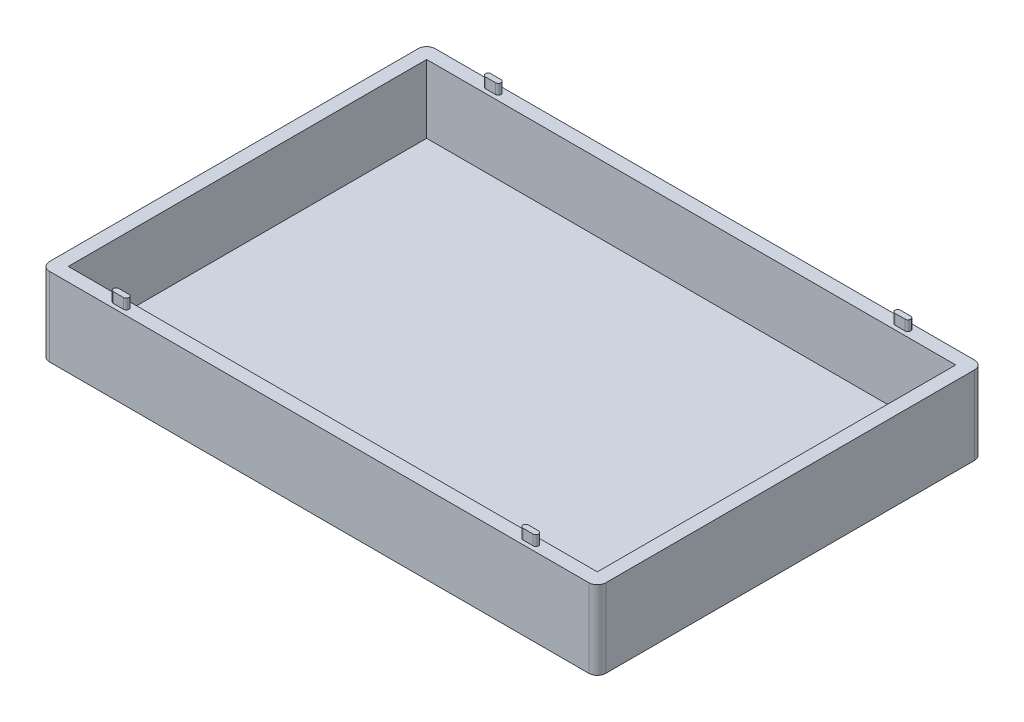
ISO-10303-21;
HEADER;
FILE_DESCRIPTION(('STEP AP214'),'2;1');
FILE_NAME('part.step','',(''),(''),'','','');
FILE_SCHEMA(('AUTOMOTIVE_DESIGN { 1 0 10303 214 1 1 1 1 }'));
ENDSEC;
DATA;
#1=APPLICATION_CONTEXT('core data for automotive mechanical design processes');
#2=APPLICATION_PROTOCOL_DEFINITION('international standard','automotive_design',2000,#1);
#3=PRODUCT_CONTEXT('',#1,'mechanical');
#4=PRODUCT('Part','Part','',(#3));
#5=PRODUCT_RELATED_PRODUCT_CATEGORY('part','',(#4));
#6=PRODUCT_DEFINITION_FORMATION('','',#4);
#7=PRODUCT_DEFINITION_CONTEXT('part definition',#1,'design');
#8=PRODUCT_DEFINITION('design','',#6,#7);
#9=PRODUCT_DEFINITION_SHAPE('','',#8);
#10=(LENGTH_UNIT() NAMED_UNIT(*) SI_UNIT(.MILLI.,.METRE.));
#11=(NAMED_UNIT(*) PLANE_ANGLE_UNIT() SI_UNIT($,.RADIAN.));
#12=(NAMED_UNIT(*) SI_UNIT($,.STERADIAN.) SOLID_ANGLE_UNIT());
#13=UNCERTAINTY_MEASURE_WITH_UNIT(LENGTH_MEASURE(1.E-05),#10,'distance_accuracy_value','');
#14=(GEOMETRIC_REPRESENTATION_CONTEXT(3) GLOBAL_UNCERTAINTY_ASSIGNED_CONTEXT((#13)) GLOBAL_UNIT_ASSIGNED_CONTEXT((#10,
#11,#12)) REPRESENTATION_CONTEXT('',''));
#15=CARTESIAN_POINT('',(0.,0.,0.));
#16=DIRECTION('',(0.,0.,1.));
#17=DIRECTION('',(1.,0.,0.));
#18=AXIS2_PLACEMENT_3D('',#15,#16,#17);
#19=CARTESIAN_POINT('',(0.,23.,0.));
#20=DIRECTION('',(0.,1.,0.));
#21=DIRECTION('',(0.,0.,1.));
#22=AXIS2_PLACEMENT_3D('',#19,#20,#21);
#23=PLANE('',#22);
#24=DIRECTION('',(0.,0.,-1.));
#25=VECTOR('',#24,1.);
#26=CARTESIAN_POINT('',(77.5,23.,52.5));
#27=LINE('',#26,#25);
#28=CARTESIAN_POINT('',(77.5,23.,52.5));
#29=VERTEX_POINT('',#28);
#30=CARTESIAN_POINT('',(77.5,23.,-52.5));
#31=VERTEX_POINT('',#30);
#32=EDGE_CURVE('E335',#29,#31,#27,.T.);
#33=ORIENTED_EDGE('',*,*,#32,.F.);
#34=DIRECTION('',(-1.,0.,0.));
#35=VECTOR('',#34,1.);
#36=CARTESIAN_POINT('',(77.5,23.,52.5));
#37=LINE('',#36,#35);
#38=CARTESIAN_POINT('',(-77.5,23.,52.5));
#39=VERTEX_POINT('',#38);
#40=EDGE_CURVE('E340',#29,#39,#37,.T.);
#41=ORIENTED_EDGE('',*,*,#40,.T.);
#42=DIRECTION('',(0.,0.,-1.));
#43=VECTOR('',#42,1.);
#44=CARTESIAN_POINT('',(-77.5,23.,52.5));
#45=LINE('',#44,#43);
#46=CARTESIAN_POINT('',(-77.5,23.,-52.5));
#47=VERTEX_POINT('',#46);
#48=EDGE_CURVE('E352',#39,#47,#45,.T.);
#49=ORIENTED_EDGE('',*,*,#48,.T.);
#50=DIRECTION('',(-1.,0.,0.));
#51=VECTOR('',#50,1.);
#52=CARTESIAN_POINT('',(77.5,23.,-52.5));
#53=LINE('',#52,#51);
#54=EDGE_CURVE('E349',#31,#47,#53,.T.);
#55=ORIENTED_EDGE('',*,*,#54,.F.);
#56=EDGE_LOOP('',(#33,#41,#49,#55));
#57=FACE_BOUND('',#56,.T.);
#58=DIRECTION('',(0.,0.,-1.));
#59=VECTOR('',#58,1.);
#60=CARTESIAN_POINT('',(81.5,23.,-56.5));
#61=LINE('',#60,#59);
#62=CARTESIAN_POINT('',(81.5,23.,54.));
#63=VERTEX_POINT('',#62);
#64=CARTESIAN_POINT('',(81.5,23.,-54.));
#65=VERTEX_POINT('',#64);
#66=EDGE_CURVE('E366',#63,#65,#61,.T.);
#67=ORIENTED_EDGE('',*,*,#66,.T.);
#68=CARTESIAN_POINT('',(79.,23.,-54.));
#69=DIRECTION('',(0.,1.,0.));
#70=DIRECTION('',(0.,0.,1.));
#71=AXIS2_PLACEMENT_3D('',#68,#69,#70);
#72=CIRCLE('',#71,2.5);
#73=CARTESIAN_POINT('',(79.,23.,-56.5));
#74=VERTEX_POINT('',#73);
#75=EDGE_CURVE('E415',#65,#74,#72,.T.);
#76=ORIENTED_EDGE('',*,*,#75,.T.);
#77=DIRECTION('',(-1.,0.,0.));
#78=VECTOR('',#77,1.);
#79=CARTESIAN_POINT('',(-81.5,23.,-56.5));
#80=LINE('',#79,#78);
#81=CARTESIAN_POINT('',(-79.,23.,-56.5));
#82=VERTEX_POINT('',#81);
#83=EDGE_CURVE('E369',#74,#82,#80,.T.);
#84=ORIENTED_EDGE('',*,*,#83,.T.);
#85=CARTESIAN_POINT('',(-79.,23.,-54.));
#86=DIRECTION('',(0.,1.,0.));
#87=DIRECTION('',(0.,0.,1.));
#88=AXIS2_PLACEMENT_3D('',#85,#86,#87);
#89=CIRCLE('',#88,2.5);
#90=CARTESIAN_POINT('',(-81.5,23.,-54.));
#91=VERTEX_POINT('',#90);
#92=EDGE_CURVE('E413',#82,#91,#89,.T.);
#93=ORIENTED_EDGE('',*,*,#92,.T.);
#94=DIRECTION('',(0.,0.,1.));
#95=VECTOR('',#94,1.);
#96=CARTESIAN_POINT('',(-81.5,23.,-56.5));
#97=LINE('',#96,#95);
#98=CARTESIAN_POINT('',(-81.5,23.,54.));
#99=VERTEX_POINT('',#98);
#100=EDGE_CURVE('E373',#91,#99,#97,.T.);
#101=ORIENTED_EDGE('',*,*,#100,.T.);
#102=CARTESIAN_POINT('',(-79.,23.,54.));
#103=DIRECTION('',(0.,1.,0.));
#104=DIRECTION('',(0.,0.,1.));
#105=AXIS2_PLACEMENT_3D('',#102,#103,#104);
#106=CIRCLE('',#105,2.5);
#107=CARTESIAN_POINT('',(-79.,23.,56.5));
#108=VERTEX_POINT('',#107);
#109=EDGE_CURVE('E411',#99,#108,#106,.T.);
#110=ORIENTED_EDGE('',*,*,#109,.T.);
#111=DIRECTION('',(1.,0.,0.));
#112=VECTOR('',#111,1.);
#113=CARTESIAN_POINT('',(-81.5,23.,56.5));
#114=LINE('',#113,#112);
#115=CARTESIAN_POINT('',(79.,23.,56.5));
#116=VERTEX_POINT('',#115);
#117=EDGE_CURVE('E376',#108,#116,#114,.T.);
#118=ORIENTED_EDGE('',*,*,#117,.T.);
#119=CARTESIAN_POINT('',(79.,23.,54.));
#120=DIRECTION('',(0.,1.,0.));
#121=DIRECTION('',(0.,0.,1.));
#122=AXIS2_PLACEMENT_3D('',#119,#120,#121);
#123=CIRCLE('',#122,2.5);
#124=EDGE_CURVE('E396',#116,#63,#123,.T.);
#125=ORIENTED_EDGE('',*,*,#124,.T.);
#126=EDGE_LOOP('',(#67,#76,#84,#93,#101,#110,#118,#125));
#127=FACE_BOUND('',#126,.T.);
#128=DIRECTION('',(1.,0.,0.));
#129=VECTOR('',#128,1.);
#130=CARTESIAN_POINT('',(58.5,23.,55.3));
#131=LINE('',#130,#129);
#132=CARTESIAN_POINT('',(58.5,23.,55.3));
#133=VERTEX_POINT('',#132);
#134=CARTESIAN_POINT('',(61.5,23.,55.3));
#135=VERTEX_POINT('',#134);
#136=EDGE_CURVE('E320',#133,#135,#131,.T.);
#137=ORIENTED_EDGE('',*,*,#136,.F.);
#138=CARTESIAN_POINT('',(58.5,23.,54.5));
#139=DIRECTION('',(0.,1.,0.));
#140=DIRECTION('',(0.,0.,1.));
#141=AXIS2_PLACEMENT_3D('',#138,#139,#140);
#142=CIRCLE('',#141,0.800000000000002);
#143=CARTESIAN_POINT('',(58.5,23.,53.7));
#144=VERTEX_POINT('',#143);
#145=EDGE_CURVE('E306',#144,#133,#142,.T.);
#146=ORIENTED_EDGE('',*,*,#145,.F.);
#147=DIRECTION('',(-1.,0.,0.));
#148=VECTOR('',#147,1.);
#149=CARTESIAN_POINT('',(58.5,23.,53.7));
#150=LINE('',#149,#148);
#151=CARTESIAN_POINT('',(61.5,23.,53.7));
#152=VERTEX_POINT('',#151);
#153=EDGE_CURVE('E311',#152,#144,#150,.T.);
#154=ORIENTED_EDGE('',*,*,#153,.F.);
#155=CARTESIAN_POINT('',(61.5,23.,54.5));
#156=DIRECTION('',(0.,1.,0.));
#157=DIRECTION('',(0.,0.,1.));
#158=AXIS2_PLACEMENT_3D('',#155,#156,#157);
#159=CIRCLE('',#158,0.800000000000002);
#160=EDGE_CURVE('E322',#135,#152,#159,.T.);
#161=ORIENTED_EDGE('',*,*,#160,.F.);
#162=EDGE_LOOP('',(#137,#146,#154,#161));
#163=FACE_BOUND('',#162,.T.);
#164=DIRECTION('',(1.,0.,0.));
#165=VECTOR('',#164,1.);
#166=CARTESIAN_POINT('',(-61.5,23.,55.3));
#167=LINE('',#166,#165);
#168=CARTESIAN_POINT('',(-61.5,23.,55.3));
#169=VERTEX_POINT('',#168);
#170=CARTESIAN_POINT('',(-58.5,23.,55.3));
#171=VERTEX_POINT('',#170);
#172=EDGE_CURVE('E291',#169,#171,#167,.T.);
#173=ORIENTED_EDGE('',*,*,#172,.F.);
#174=CARTESIAN_POINT('',(-61.5,23.,54.5));
#175=DIRECTION('',(0.,1.,0.));
#176=DIRECTION('',(0.,0.,1.));
#177=AXIS2_PLACEMENT_3D('',#174,#175,#176);
#178=CIRCLE('',#177,0.800000000000002);
#179=CARTESIAN_POINT('',(-61.5,23.,53.7));
#180=VERTEX_POINT('',#179);
#181=EDGE_CURVE('E277',#180,#169,#178,.T.);
#182=ORIENTED_EDGE('',*,*,#181,.F.);
#183=DIRECTION('',(-1.,0.,0.));
#184=VECTOR('',#183,1.);
#185=CARTESIAN_POINT('',(-61.5,23.,53.7));
#186=LINE('',#185,#184);
#187=CARTESIAN_POINT('',(-58.5,23.,53.7));
#188=VERTEX_POINT('',#187);
#189=EDGE_CURVE('E282',#188,#180,#186,.T.);
#190=ORIENTED_EDGE('',*,*,#189,.F.);
#191=CARTESIAN_POINT('',(-58.5,23.,54.5));
#192=DIRECTION('',(0.,1.,0.));
#193=DIRECTION('',(0.,0.,1.));
#194=AXIS2_PLACEMENT_3D('',#191,#192,#193);
#195=CIRCLE('',#194,0.800000000000002);
#196=EDGE_CURVE('E293',#171,#188,#195,.T.);
#197=ORIENTED_EDGE('',*,*,#196,.F.);
#198=EDGE_LOOP('',(#173,#182,#190,#197));
#199=FACE_BOUND('',#198,.T.);
#200=DIRECTION('',(1.,0.,0.));
#201=VECTOR('',#200,1.);
#202=CARTESIAN_POINT('',(-61.5,23.,-53.7));
#203=LINE('',#202,#201);
#204=CARTESIAN_POINT('',(-61.5,23.,-53.7));
#205=VERTEX_POINT('',#204);
#206=CARTESIAN_POINT('',(-58.5,23.,-53.7));
#207=VERTEX_POINT('',#206);
#208=EDGE_CURVE('E249',#205,#207,#203,.T.);
#209=ORIENTED_EDGE('',*,*,#208,.F.);
#210=CARTESIAN_POINT('',(-61.5,23.,-54.5));
#211=DIRECTION('',(0.,1.,0.));
#212=DIRECTION('',(0.,0.,1.));
#213=AXIS2_PLACEMENT_3D('',#210,#211,#212);
#214=CIRCLE('',#213,0.800000000000006);
#215=CARTESIAN_POINT('',(-61.5,23.,-55.3));
#216=VERTEX_POINT('',#215);
#217=EDGE_CURVE('E246',#216,#205,#214,.T.);
#218=ORIENTED_EDGE('',*,*,#217,.F.);
#219=DIRECTION('',(-1.,0.,0.));
#220=VECTOR('',#219,1.);
#221=CARTESIAN_POINT('',(-61.5,23.,-55.3));
#222=LINE('',#221,#220);
#223=CARTESIAN_POINT('',(-58.5,23.,-55.3));
#224=VERTEX_POINT('',#223);
#225=EDGE_CURVE('E258',#224,#216,#222,.T.);
#226=ORIENTED_EDGE('',*,*,#225,.F.);
#227=CARTESIAN_POINT('',(-58.5,23.,-54.5));
#228=DIRECTION('',(0.,1.,0.));
#229=DIRECTION('',(0.,0.,1.));
#230=AXIS2_PLACEMENT_3D('',#227,#228,#229);
#231=CIRCLE('',#230,0.800000000000006);
#232=EDGE_CURVE('E266',#207,#224,#231,.T.);
#233=ORIENTED_EDGE('',*,*,#232,.F.);
#234=EDGE_LOOP('',(#209,#218,#226,#233));
#235=FACE_BOUND('',#234,.T.);
#236=DIRECTION('',(1.,0.,0.));
#237=VECTOR('',#236,1.);
#238=CARTESIAN_POINT('',(58.5,23.,-53.7));
#239=LINE('',#238,#237);
#240=CARTESIAN_POINT('',(58.5,23.,-53.7));
#241=VERTEX_POINT('',#240);
#242=CARTESIAN_POINT('',(61.5,23.,-53.7));
#243=VERTEX_POINT('',#242);
#244=EDGE_CURVE('E774',#241,#243,#239,.T.);
#245=ORIENTED_EDGE('',*,*,#244,.F.);
#246=CARTESIAN_POINT('',(58.5,23.,-54.5));
#247=DIRECTION('',(0.,1.,0.));
#248=DIRECTION('',(0.,0.,1.));
#249=AXIS2_PLACEMENT_3D('',#246,#247,#248);
#250=CIRCLE('',#249,0.800000000000002);
#251=CARTESIAN_POINT('',(58.5,23.,-55.3));
#252=VERTEX_POINT('',#251);
#253=EDGE_CURVE('E244',#252,#241,#250,.T.);
#254=ORIENTED_EDGE('',*,*,#253,.F.);
#255=DIRECTION('',(-1.,0.,0.));
#256=VECTOR('',#255,1.);
#257=CARTESIAN_POINT('',(58.5,23.,-55.3));
#258=LINE('',#257,#256);
#259=CARTESIAN_POINT('',(61.5,23.,-55.3));
#260=VERTEX_POINT('',#259);
#261=EDGE_CURVE('E240',#260,#252,#258,.T.);
#262=ORIENTED_EDGE('',*,*,#261,.F.);
#263=CARTESIAN_POINT('',(61.5,23.,-54.5));
#264=DIRECTION('',(0.,1.,0.));
#265=DIRECTION('',(0.,0.,1.));
#266=AXIS2_PLACEMENT_3D('',#263,#264,#265);
#267=CIRCLE('',#266,0.800000000000002);
#268=EDGE_CURVE('E771',#243,#260,#267,.T.);
#269=ORIENTED_EDGE('',*,*,#268,.F.);
#270=EDGE_LOOP('',(#245,#254,#262,#269));
#271=FACE_BOUND('',#270,.T.);
#272=ADVANCED_FACE('F35',(#57,#127,#163,#199,#235,#271),#23,.T.);
#273=CARTESIAN_POINT('',(81.5,23.,-56.5));
#274=DIRECTION('',(-1.,0.,0.));
#275=DIRECTION('',(0.,0.,1.));
#276=AXIS2_PLACEMENT_3D('',#273,#274,#275);
#277=PLANE('',#276);
#278=DIRECTION('',(0.,0.,-1.));
#279=VECTOR('',#278,1.);
#280=CARTESIAN_POINT('',(81.5,0.,-56.5));
#281=LINE('',#280,#279);
#282=CARTESIAN_POINT('',(81.5,0.,54.));
#283=VERTEX_POINT('',#282);
#284=CARTESIAN_POINT('',(81.5,0.,-54.));
#285=VERTEX_POINT('',#284);
#286=EDGE_CURVE('E359',#283,#285,#281,.T.);
#287=ORIENTED_EDGE('',*,*,#286,.T.);
#288=DIRECTION('',(0.,-1.,0.));
#289=VECTOR('',#288,1.);
#290=CARTESIAN_POINT('',(81.5,23.,-54.));
#291=LINE('',#290,#289);
#292=EDGE_CURVE('E409',#285,#65,#291,.F.);
#293=ORIENTED_EDGE('',*,*,#292,.T.);
#294=ORIENTED_EDGE('',*,*,#66,.F.);
#295=DIRECTION('',(0.,-1.,0.));
#296=VECTOR('',#295,1.);
#297=CARTESIAN_POINT('',(81.5,23.,54.));
#298=LINE('',#297,#296);
#299=EDGE_CURVE('E378',#63,#283,#298,.T.);
#300=ORIENTED_EDGE('',*,*,#299,.T.);
#301=EDGE_LOOP('',(#287,#293,#294,#300));
#302=FACE_BOUND('',#301,.T.);
#303=ADVANCED_FACE('F452',(#302),#277,.F.);
#304=CARTESIAN_POINT('',(-81.5,23.,-56.5));
#305=DIRECTION('',(0.,0.,1.));
#306=DIRECTION('',(1.,0.,0.));
#307=AXIS2_PLACEMENT_3D('',#304,#305,#306);
#308=PLANE('',#307);
#309=ORIENTED_EDGE('',*,*,#83,.F.);
#310=DIRECTION('',(0.,-1.,0.));
#311=VECTOR('',#310,1.);
#312=CARTESIAN_POINT('',(79.,23.,-56.5));
#313=LINE('',#312,#311);
#314=CARTESIAN_POINT('',(79.,0.,-56.5));
#315=VERTEX_POINT('',#314);
#316=EDGE_CURVE('E400',#74,#315,#313,.T.);
#317=ORIENTED_EDGE('',*,*,#316,.T.);
#318=DIRECTION('',(-1.,0.,0.));
#319=VECTOR('',#318,1.);
#320=CARTESIAN_POINT('',(-81.5,0.,-56.5));
#321=LINE('',#320,#319);
#322=CARTESIAN_POINT('',(-79.,0.,-56.5));
#323=VERTEX_POINT('',#322);
#324=EDGE_CURVE('E381',#315,#323,#321,.T.);
#325=ORIENTED_EDGE('',*,*,#324,.T.);
#326=DIRECTION('',(0.,-1.,0.));
#327=VECTOR('',#326,1.);
#328=CARTESIAN_POINT('',(-79.,23.,-56.5));
#329=LINE('',#328,#327);
#330=EDGE_CURVE('E398',#323,#82,#329,.F.);
#331=ORIENTED_EDGE('',*,*,#330,.T.);
#332=EDGE_LOOP('',(#309,#317,#325,#331));
#333=FACE_BOUND('',#332,.T.);
#334=ADVANCED_FACE('F446',(#333),#308,.F.);
#335=CARTESIAN_POINT('',(-81.5,23.,-56.5));
#336=DIRECTION('',(1.,0.,0.));
#337=DIRECTION('',(0.,0.,-1.));
#338=AXIS2_PLACEMENT_3D('',#335,#336,#337);
#339=PLANE('',#338);
#340=ORIENTED_EDGE('',*,*,#100,.F.);
#341=DIRECTION('',(0.,-1.,0.));
#342=VECTOR('',#341,1.);
#343=CARTESIAN_POINT('',(-81.5,23.,-54.));
#344=LINE('',#343,#342);
#345=CARTESIAN_POINT('',(-81.5,0.,-54.));
#346=VERTEX_POINT('',#345);
#347=EDGE_CURVE('E43',#91,#346,#344,.T.);
#348=ORIENTED_EDGE('',*,*,#347,.T.);
#349=DIRECTION('',(0.,0.,1.));
#350=VECTOR('',#349,1.);
#351=CARTESIAN_POINT('',(-81.5,0.,-56.5));
#352=LINE('',#351,#350);
#353=CARTESIAN_POINT('',(-81.5,0.,54.));
#354=VERTEX_POINT('',#353);
#355=EDGE_CURVE('E384',#346,#354,#352,.T.);
#356=ORIENTED_EDGE('',*,*,#355,.T.);
#357=DIRECTION('',(0.,-1.,0.));
#358=VECTOR('',#357,1.);
#359=CARTESIAN_POINT('',(-81.5,23.,54.));
#360=LINE('',#359,#358);
#361=EDGE_CURVE('E417',#354,#99,#360,.F.);
#362=ORIENTED_EDGE('',*,*,#361,.T.);
#363=EDGE_LOOP('',(#340,#348,#356,#362));
#364=FACE_BOUND('',#363,.T.);
#365=ADVANCED_FACE('F423',(#364),#339,.F.);
#366=CARTESIAN_POINT('',(-81.5,23.,56.5));
#367=DIRECTION('',(0.,0.,-1.));
#368=DIRECTION('',(-1.,0.,0.));
#369=AXIS2_PLACEMENT_3D('',#366,#367,#368);
#370=PLANE('',#369);
#371=ORIENTED_EDGE('',*,*,#117,.F.);
#372=DIRECTION('',(0.,-1.,0.));
#373=VECTOR('',#372,1.);
#374=CARTESIAN_POINT('',(-79.,23.,56.5));
#375=LINE('',#374,#373);
#376=CARTESIAN_POINT('',(-79.,0.,56.5));
#377=VERTEX_POINT('',#376);
#378=EDGE_CURVE('E12',#108,#377,#375,.T.);
#379=ORIENTED_EDGE('',*,*,#378,.T.);
#380=DIRECTION('',(1.,0.,0.));
#381=VECTOR('',#380,1.);
#382=CARTESIAN_POINT('',(-81.5,0.,56.5));
#383=LINE('',#382,#381);
#384=CARTESIAN_POINT('',(79.,0.,56.5));
#385=VERTEX_POINT('',#384);
#386=EDGE_CURVE('E370',#377,#385,#383,.T.);
#387=ORIENTED_EDGE('',*,*,#386,.T.);
#388=DIRECTION('',(0.,-1.,0.));
#389=VECTOR('',#388,1.);
#390=CARTESIAN_POINT('',(79.,23.,56.5));
#391=LINE('',#390,#389);
#392=EDGE_CURVE('E393',#385,#116,#391,.F.);
#393=ORIENTED_EDGE('',*,*,#392,.T.);
#394=EDGE_LOOP('',(#371,#379,#387,#393));
#395=FACE_BOUND('',#394,.T.);
#396=ADVANCED_FACE('F436',(#395),#370,.F.);
#397=CARTESIAN_POINT('',(0.,0.,0.));
#398=DIRECTION('',(0.,1.,0.));
#399=DIRECTION('',(0.,0.,1.));
#400=AXIS2_PLACEMENT_3D('',#397,#398,#399);
#401=PLANE('',#400);
#402=ORIENTED_EDGE('',*,*,#324,.F.);
#403=CARTESIAN_POINT('',(79.,0.,-54.));
#404=DIRECTION('',(0.,1.,0.));
#405=DIRECTION('',(0.,0.,1.));
#406=AXIS2_PLACEMENT_3D('',#403,#404,#405);
#407=CIRCLE('',#406,2.5);
#408=EDGE_CURVE('E407',#315,#285,#407,.F.);
#409=ORIENTED_EDGE('',*,*,#408,.T.);
#410=ORIENTED_EDGE('',*,*,#286,.F.);
#411=CARTESIAN_POINT('',(79.,0.,54.));
#412=DIRECTION('',(0.,1.,0.));
#413=DIRECTION('',(0.,0.,1.));
#414=AXIS2_PLACEMENT_3D('',#411,#412,#413);
#415=CIRCLE('',#414,2.5);
#416=EDGE_CURVE('E390',#283,#385,#415,.F.);
#417=ORIENTED_EDGE('',*,*,#416,.T.);
#418=ORIENTED_EDGE('',*,*,#386,.F.);
#419=CARTESIAN_POINT('',(-79.,0.,54.));
#420=DIRECTION('',(0.,1.,0.));
#421=DIRECTION('',(0.,0.,1.));
#422=AXIS2_PLACEMENT_3D('',#419,#420,#421);
#423=CIRCLE('',#422,2.5);
#424=EDGE_CURVE('E403',#377,#354,#423,.F.);
#425=ORIENTED_EDGE('',*,*,#424,.T.);
#426=ORIENTED_EDGE('',*,*,#355,.F.);
#427=CARTESIAN_POINT('',(-79.,0.,-54.));
#428=DIRECTION('',(0.,1.,0.));
#429=DIRECTION('',(0.,0.,1.));
#430=AXIS2_PLACEMENT_3D('',#427,#428,#429);
#431=CIRCLE('',#430,2.5);
#432=EDGE_CURVE('E405',#346,#323,#431,.F.);
#433=ORIENTED_EDGE('',*,*,#432,.T.);
#434=EDGE_LOOP('',(#402,#409,#410,#417,#418,#425,#426,#433));
#435=FACE_BOUND('',#434,.T.);
#436=ADVANCED_FACE('F429',(#435),#401,.F.);
#437=CARTESIAN_POINT('',(79.,23.,54.));
#438=DIRECTION('',(0.,-1.,0.));
#439=DIRECTION('',(0.,0.,-1.));
#440=AXIS2_PLACEMENT_3D('',#437,#438,#439);
#441=CYLINDRICAL_SURFACE('',#440,2.5);
#442=ORIENTED_EDGE('',*,*,#124,.F.);
#443=ORIENTED_EDGE('',*,*,#392,.F.);
#444=ORIENTED_EDGE('',*,*,#416,.F.);
#445=ORIENTED_EDGE('',*,*,#299,.F.);
#446=EDGE_LOOP('',(#442,#443,#444,#445));
#447=FACE_BOUND('',#446,.T.);
#448=ADVANCED_FACE('F457',(#447),#441,.T.);
#449=CARTESIAN_POINT('',(79.,23.,-54.));
#450=DIRECTION('',(0.,-1.,0.));
#451=DIRECTION('',(0.,0.,-1.));
#452=AXIS2_PLACEMENT_3D('',#449,#450,#451);
#453=CYLINDRICAL_SURFACE('',#452,2.5);
#454=ORIENTED_EDGE('',*,*,#75,.F.);
#455=ORIENTED_EDGE('',*,*,#292,.F.);
#456=ORIENTED_EDGE('',*,*,#408,.F.);
#457=ORIENTED_EDGE('',*,*,#316,.F.);
#458=EDGE_LOOP('',(#454,#455,#456,#457));
#459=FACE_BOUND('',#458,.T.);
#460=ADVANCED_FACE('F455',(#459),#453,.T.);
#461=CARTESIAN_POINT('',(-79.,23.,-54.));
#462=DIRECTION('',(0.,-1.,0.));
#463=DIRECTION('',(0.,0.,-1.));
#464=AXIS2_PLACEMENT_3D('',#461,#462,#463);
#465=CYLINDRICAL_SURFACE('',#464,2.5);
#466=ORIENTED_EDGE('',*,*,#92,.F.);
#467=ORIENTED_EDGE('',*,*,#330,.F.);
#468=ORIENTED_EDGE('',*,*,#432,.F.);
#469=ORIENTED_EDGE('',*,*,#347,.F.);
#470=EDGE_LOOP('',(#466,#467,#468,#469));
#471=FACE_BOUND('',#470,.T.);
#472=ADVANCED_FACE('F444',(#471),#465,.T.);
#473=CARTESIAN_POINT('',(-79.,23.,54.));
#474=DIRECTION('',(0.,-1.,0.));
#475=DIRECTION('',(0.,0.,-1.));
#476=AXIS2_PLACEMENT_3D('',#473,#474,#475);
#477=CYLINDRICAL_SURFACE('',#476,2.5);
#478=ORIENTED_EDGE('',*,*,#109,.F.);
#479=ORIENTED_EDGE('',*,*,#361,.F.);
#480=ORIENTED_EDGE('',*,*,#424,.F.);
#481=ORIENTED_EDGE('',*,*,#378,.F.);
#482=EDGE_LOOP('',(#478,#479,#480,#481));
#483=FACE_BOUND('',#482,.T.);
#484=ADVANCED_FACE('F37',(#483),#477,.T.);
#485=CARTESIAN_POINT('',(77.5,3.,52.5));
#486=DIRECTION('',(1.,0.,0.));
#487=DIRECTION('',(0.,0.,-1.));
#488=AXIS2_PLACEMENT_3D('',#485,#486,#487);
#489=PLANE('',#488);
#490=ORIENTED_EDGE('',*,*,#32,.T.);
#491=DIRECTION('',(0.,1.,0.));
#492=VECTOR('',#491,1.);
#493=CARTESIAN_POINT('',(77.5,3.,-52.5));
#494=LINE('',#493,#492);
#495=CARTESIAN_POINT('',(77.5,3.,-52.5));
#496=VERTEX_POINT('',#495);
#497=EDGE_CURVE('E347',#496,#31,#494,.T.);
#498=ORIENTED_EDGE('',*,*,#497,.F.);
#499=DIRECTION('',(0.,0.,-1.));
#500=VECTOR('',#499,1.);
#501=CARTESIAN_POINT('',(77.5,3.,52.5));
#502=LINE('',#501,#500);
#503=CARTESIAN_POINT('',(77.5,3.,52.5));
#504=VERTEX_POINT('',#503);
#505=EDGE_CURVE('E336',#504,#496,#502,.T.);
#506=ORIENTED_EDGE('',*,*,#505,.F.);
#507=DIRECTION('',(0.,1.,0.));
#508=VECTOR('',#507,1.);
#509=CARTESIAN_POINT('',(77.5,3.,52.5));
#510=LINE('',#509,#508);
#511=EDGE_CURVE('E357',#504,#29,#510,.T.);
#512=ORIENTED_EDGE('',*,*,#511,.T.);
#513=EDGE_LOOP('',(#490,#498,#506,#512));
#514=FACE_BOUND('',#513,.T.);
#515=ADVANCED_FACE('F475',(#514),#489,.F.);
#516=CARTESIAN_POINT('',(77.5,3.,52.5));
#517=DIRECTION('',(0.,0.,-1.));
#518=DIRECTION('',(-1.,0.,0.));
#519=AXIS2_PLACEMENT_3D('',#516,#517,#518);
#520=PLANE('',#519);
#521=ORIENTED_EDGE('',*,*,#40,.F.);
#522=ORIENTED_EDGE('',*,*,#511,.F.);
#523=DIRECTION('',(-1.,0.,0.));
#524=VECTOR('',#523,1.);
#525=CARTESIAN_POINT('',(77.5,3.,52.5));
#526=LINE('',#525,#524);
#527=CARTESIAN_POINT('',(-77.5,3.,52.5));
#528=VERTEX_POINT('',#527);
#529=EDGE_CURVE('E345',#504,#528,#526,.T.);
#530=ORIENTED_EDGE('',*,*,#529,.T.);
#531=DIRECTION('',(0.,1.,0.));
#532=VECTOR('',#531,1.);
#533=CARTESIAN_POINT('',(-77.5,3.,52.5));
#534=LINE('',#533,#532);
#535=EDGE_CURVE('E360',#528,#39,#534,.T.);
#536=ORIENTED_EDGE('',*,*,#535,.T.);
#537=EDGE_LOOP('',(#521,#522,#530,#536));
#538=FACE_BOUND('',#537,.T.);
#539=ADVANCED_FACE('F529',(#538),#520,.T.);
#540=CARTESIAN_POINT('',(-77.5,3.,52.5));
#541=DIRECTION('',(1.,0.,0.));
#542=DIRECTION('',(0.,0.,-1.));
#543=AXIS2_PLACEMENT_3D('',#540,#541,#542);
#544=PLANE('',#543);
#545=ORIENTED_EDGE('',*,*,#48,.F.);
#546=ORIENTED_EDGE('',*,*,#535,.F.);
#547=DIRECTION('',(0.,0.,-1.));
#548=VECTOR('',#547,1.);
#549=CARTESIAN_POINT('',(-77.5,3.,52.5));
#550=LINE('',#549,#548);
#551=CARTESIAN_POINT('',(-77.5,3.,-52.5));
#552=VERTEX_POINT('',#551);
#553=EDGE_CURVE('E343',#528,#552,#550,.T.);
#554=ORIENTED_EDGE('',*,*,#553,.T.);
#555=DIRECTION('',(0.,1.,0.));
#556=VECTOR('',#555,1.);
#557=CARTESIAN_POINT('',(-77.5,3.,-52.5));
#558=LINE('',#557,#556);
#559=EDGE_CURVE('E362',#552,#47,#558,.T.);
#560=ORIENTED_EDGE('',*,*,#559,.T.);
#561=EDGE_LOOP('',(#545,#546,#554,#560));
#562=FACE_BOUND('',#561,.T.);
#563=ADVANCED_FACE('F538',(#562),#544,.T.);
#564=CARTESIAN_POINT('',(77.5,3.,-52.5));
#565=DIRECTION('',(0.,0.,-1.));
#566=DIRECTION('',(-1.,0.,0.));
#567=AXIS2_PLACEMENT_3D('',#564,#565,#566);
#568=PLANE('',#567);
#569=ORIENTED_EDGE('',*,*,#54,.T.);
#570=ORIENTED_EDGE('',*,*,#559,.F.);
#571=DIRECTION('',(-1.,0.,0.));
#572=VECTOR('',#571,1.);
#573=CARTESIAN_POINT('',(77.5,3.,-52.5));
#574=LINE('',#573,#572);
#575=EDGE_CURVE('E339',#496,#552,#574,.T.);
#576=ORIENTED_EDGE('',*,*,#575,.F.);
#577=ORIENTED_EDGE('',*,*,#497,.T.);
#578=EDGE_LOOP('',(#569,#570,#576,#577));
#579=FACE_BOUND('',#578,.T.);
#580=ADVANCED_FACE('F548',(#579),#568,.F.);
#581=CARTESIAN_POINT('',(0.,3.,0.));
#582=DIRECTION('',(0.,1.,0.));
#583=DIRECTION('',(0.,0.,1.));
#584=AXIS2_PLACEMENT_3D('',#581,#582,#583);
#585=PLANE('',#584);
#586=ORIENTED_EDGE('',*,*,#505,.T.);
#587=ORIENTED_EDGE('',*,*,#575,.T.);
#588=ORIENTED_EDGE('',*,*,#553,.F.);
#589=ORIENTED_EDGE('',*,*,#529,.F.);
#590=EDGE_LOOP('',(#586,#587,#588,#589));
#591=FACE_BOUND('',#590,.T.);
#592=ADVANCED_FACE('F558',(#591),#585,.T.);
#593=CARTESIAN_POINT('',(58.5,26.,54.5));
#594=DIRECTION('',(0.,-1.,0.));
#595=DIRECTION('',(0.,0.,-1.));
#596=AXIS2_PLACEMENT_3D('',#593,#594,#595);
#597=CYLINDRICAL_SURFACE('',#596,0.800000000000002);
#598=ORIENTED_EDGE('',*,*,#145,.T.);
#599=DIRECTION('',(0.,-1.,0.));
#600=VECTOR('',#599,1.);
#601=CARTESIAN_POINT('',(58.5,26.,55.3));
#602=LINE('',#601,#600);
#603=CARTESIAN_POINT('',(58.5,26.,55.3));
#604=VERTEX_POINT('',#603);
#605=EDGE_CURVE('E333',#604,#133,#602,.T.);
#606=ORIENTED_EDGE('',*,*,#605,.F.);
#607=CARTESIAN_POINT('',(58.5,26.,54.5));
#608=DIRECTION('',(0.,1.,0.));
#609=DIRECTION('',(0.,0.,1.));
#610=AXIS2_PLACEMENT_3D('',#607,#608,#609);
#611=CIRCLE('',#610,0.800000000000002);
#612=CARTESIAN_POINT('',(58.5,26.,53.7));
#613=VERTEX_POINT('',#612);
#614=EDGE_CURVE('E307',#613,#604,#611,.T.);
#615=ORIENTED_EDGE('',*,*,#614,.F.);
#616=DIRECTION('',(0.,-1.,0.));
#617=VECTOR('',#616,1.);
#618=CARTESIAN_POINT('',(58.5,26.,53.7));
#619=LINE('',#618,#617);
#620=EDGE_CURVE('E317',#613,#144,#619,.T.);
#621=ORIENTED_EDGE('',*,*,#620,.T.);
#622=EDGE_LOOP('',(#598,#606,#615,#621));
#623=FACE_BOUND('',#622,.T.);
#624=ADVANCED_FACE('F566',(#623),#597,.T.);
#625=CARTESIAN_POINT('',(58.5,26.,55.3));
#626=DIRECTION('',(0.,0.,-1.));
#627=DIRECTION('',(-1.,0.,0.));
#628=AXIS2_PLACEMENT_3D('',#625,#626,#627);
#629=PLANE('',#628);
#630=ORIENTED_EDGE('',*,*,#136,.T.);
#631=DIRECTION('',(0.,-1.,0.));
#632=VECTOR('',#631,1.);
#633=CARTESIAN_POINT('',(61.5,26.,55.3));
#634=LINE('',#633,#632);
#635=CARTESIAN_POINT('',(61.5,26.,55.3));
#636=VERTEX_POINT('',#635);
#637=EDGE_CURVE('E330',#636,#135,#634,.T.);
#638=ORIENTED_EDGE('',*,*,#637,.F.);
#639=DIRECTION('',(1.,0.,0.));
#640=VECTOR('',#639,1.);
#641=CARTESIAN_POINT('',(58.5,26.,55.3));
#642=LINE('',#641,#640);
#643=EDGE_CURVE('E310',#604,#636,#642,.T.);
#644=ORIENTED_EDGE('',*,*,#643,.F.);
#645=ORIENTED_EDGE('',*,*,#605,.T.);
#646=EDGE_LOOP('',(#630,#638,#644,#645));
#647=FACE_BOUND('',#646,.T.);
#648=ADVANCED_FACE('F581',(#647),#629,.F.);
#649=CARTESIAN_POINT('',(61.5,26.,54.5));
#650=DIRECTION('',(0.,-1.,0.));
#651=DIRECTION('',(0.,0.,-1.));
#652=AXIS2_PLACEMENT_3D('',#649,#650,#651);
#653=CYLINDRICAL_SURFACE('',#652,0.800000000000002);
#654=ORIENTED_EDGE('',*,*,#160,.T.);
#655=DIRECTION('',(0.,-1.,0.));
#656=VECTOR('',#655,1.);
#657=CARTESIAN_POINT('',(61.5,26.,53.7));
#658=LINE('',#657,#656);
#659=CARTESIAN_POINT('',(61.5,26.,53.7));
#660=VERTEX_POINT('',#659);
#661=EDGE_CURVE('E328',#660,#152,#658,.T.);
#662=ORIENTED_EDGE('',*,*,#661,.F.);
#663=CARTESIAN_POINT('',(61.5,26.,54.5));
#664=DIRECTION('',(0.,1.,0.));
#665=DIRECTION('',(0.,0.,1.));
#666=AXIS2_PLACEMENT_3D('',#663,#664,#665);
#667=CIRCLE('',#666,0.800000000000002);
#668=EDGE_CURVE('E313',#636,#660,#667,.T.);
#669=ORIENTED_EDGE('',*,*,#668,.F.);
#670=ORIENTED_EDGE('',*,*,#637,.T.);
#671=EDGE_LOOP('',(#654,#662,#669,#670));
#672=FACE_BOUND('',#671,.T.);
#673=ADVANCED_FACE('F591',(#672),#653,.T.);
#674=CARTESIAN_POINT('',(58.5,26.,53.7));
#675=DIRECTION('',(0.,0.,1.));
#676=DIRECTION('',(1.,0.,0.));
#677=AXIS2_PLACEMENT_3D('',#674,#675,#676);
#678=PLANE('',#677);
#679=ORIENTED_EDGE('',*,*,#153,.T.);
#680=ORIENTED_EDGE('',*,*,#620,.F.);
#681=DIRECTION('',(-1.,0.,0.));
#682=VECTOR('',#681,1.);
#683=CARTESIAN_POINT('',(58.5,26.,53.7));
#684=LINE('',#683,#682);
#685=EDGE_CURVE('E315',#660,#613,#684,.T.);
#686=ORIENTED_EDGE('',*,*,#685,.F.);
#687=ORIENTED_EDGE('',*,*,#661,.T.);
#688=EDGE_LOOP('',(#679,#680,#686,#687));
#689=FACE_BOUND('',#688,.T.);
#690=ADVANCED_FACE('F601',(#689),#678,.F.);
#691=CARTESIAN_POINT('',(58.5,26.,54.5));
#692=DIRECTION('',(0.,1.,0.));
#693=DIRECTION('',(0.,0.,1.));
#694=AXIS2_PLACEMENT_3D('',#691,#692,#693);
#695=PLANE('',#694);
#696=ORIENTED_EDGE('',*,*,#614,.T.);
#697=ORIENTED_EDGE('',*,*,#643,.T.);
#698=ORIENTED_EDGE('',*,*,#668,.T.);
#699=ORIENTED_EDGE('',*,*,#685,.T.);
#700=EDGE_LOOP('',(#696,#697,#698,#699));
#701=FACE_BOUND('',#700,.T.);
#702=ADVANCED_FACE('F611',(#701),#695,.T.);
#703=CARTESIAN_POINT('',(-61.5,26.,54.5));
#704=DIRECTION('',(0.,-1.,0.));
#705=DIRECTION('',(0.,0.,-1.));
#706=AXIS2_PLACEMENT_3D('',#703,#704,#705);
#707=CYLINDRICAL_SURFACE('',#706,0.800000000000002);
#708=ORIENTED_EDGE('',*,*,#181,.T.);
#709=DIRECTION('',(0.,-1.,0.));
#710=VECTOR('',#709,1.);
#711=CARTESIAN_POINT('',(-61.5,26.,55.3));
#712=LINE('',#711,#710);
#713=CARTESIAN_POINT('',(-61.5,26.,55.3));
#714=VERTEX_POINT('',#713);
#715=EDGE_CURVE('E304',#714,#169,#712,.T.);
#716=ORIENTED_EDGE('',*,*,#715,.F.);
#717=CARTESIAN_POINT('',(-61.5,26.,54.5));
#718=DIRECTION('',(0.,1.,0.));
#719=DIRECTION('',(0.,0.,1.));
#720=AXIS2_PLACEMENT_3D('',#717,#718,#719);
#721=CIRCLE('',#720,0.800000000000002);
#722=CARTESIAN_POINT('',(-61.5,26.,53.7));
#723=VERTEX_POINT('',#722);
#724=EDGE_CURVE('E278',#723,#714,#721,.T.);
#725=ORIENTED_EDGE('',*,*,#724,.F.);
#726=DIRECTION('',(0.,-1.,0.));
#727=VECTOR('',#726,1.);
#728=CARTESIAN_POINT('',(-61.5,26.,53.7));
#729=LINE('',#728,#727);
#730=EDGE_CURVE('E288',#723,#180,#729,.T.);
#731=ORIENTED_EDGE('',*,*,#730,.T.);
#732=EDGE_LOOP('',(#708,#716,#725,#731));
#733=FACE_BOUND('',#732,.T.);
#734=ADVANCED_FACE('F621',(#733),#707,.T.);
#735=CARTESIAN_POINT('',(-61.5,26.,55.3));
#736=DIRECTION('',(0.,0.,-1.));
#737=DIRECTION('',(-1.,0.,0.));
#738=AXIS2_PLACEMENT_3D('',#735,#736,#737);
#739=PLANE('',#738);
#740=ORIENTED_EDGE('',*,*,#172,.T.);
#741=DIRECTION('',(0.,-1.,0.));
#742=VECTOR('',#741,1.);
#743=CARTESIAN_POINT('',(-58.5,26.,55.3));
#744=LINE('',#743,#742);
#745=CARTESIAN_POINT('',(-58.5,26.,55.3));
#746=VERTEX_POINT('',#745);
#747=EDGE_CURVE('E301',#746,#171,#744,.T.);
#748=ORIENTED_EDGE('',*,*,#747,.F.);
#749=DIRECTION('',(1.,0.,0.));
#750=VECTOR('',#749,1.);
#751=CARTESIAN_POINT('',(-61.5,26.,55.3));
#752=LINE('',#751,#750);
#753=EDGE_CURVE('E281',#714,#746,#752,.T.);
#754=ORIENTED_EDGE('',*,*,#753,.F.);
#755=ORIENTED_EDGE('',*,*,#715,.T.);
#756=EDGE_LOOP('',(#740,#748,#754,#755));
#757=FACE_BOUND('',#756,.T.);
#758=ADVANCED_FACE('F631',(#757),#739,.F.);
#759=CARTESIAN_POINT('',(-58.5,26.,54.5));
#760=DIRECTION('',(0.,-1.,0.));
#761=DIRECTION('',(0.,0.,-1.));
#762=AXIS2_PLACEMENT_3D('',#759,#760,#761);
#763=CYLINDRICAL_SURFACE('',#762,0.800000000000002);
#764=ORIENTED_EDGE('',*,*,#196,.T.);
#765=DIRECTION('',(0.,-1.,0.));
#766=VECTOR('',#765,1.);
#767=CARTESIAN_POINT('',(-58.5,26.,53.7));
#768=LINE('',#767,#766);
#769=CARTESIAN_POINT('',(-58.5,26.,53.7));
#770=VERTEX_POINT('',#769);
#771=EDGE_CURVE('E299',#770,#188,#768,.T.);
#772=ORIENTED_EDGE('',*,*,#771,.F.);
#773=CARTESIAN_POINT('',(-58.5,26.,54.5));
#774=DIRECTION('',(0.,1.,0.));
#775=DIRECTION('',(0.,0.,1.));
#776=AXIS2_PLACEMENT_3D('',#773,#774,#775);
#777=CIRCLE('',#776,0.800000000000002);
#778=EDGE_CURVE('E284',#746,#770,#777,.T.);
#779=ORIENTED_EDGE('',*,*,#778,.F.);
#780=ORIENTED_EDGE('',*,*,#747,.T.);
#781=EDGE_LOOP('',(#764,#772,#779,#780));
#782=FACE_BOUND('',#781,.T.);
#783=ADVANCED_FACE('F641',(#782),#763,.T.);
#784=CARTESIAN_POINT('',(-61.5,26.,53.7));
#785=DIRECTION('',(0.,0.,1.));
#786=DIRECTION('',(1.,0.,0.));
#787=AXIS2_PLACEMENT_3D('',#784,#785,#786);
#788=PLANE('',#787);
#789=ORIENTED_EDGE('',*,*,#189,.T.);
#790=ORIENTED_EDGE('',*,*,#730,.F.);
#791=DIRECTION('',(-1.,0.,0.));
#792=VECTOR('',#791,1.);
#793=CARTESIAN_POINT('',(-61.5,26.,53.7));
#794=LINE('',#793,#792);
#795=EDGE_CURVE('E286',#770,#723,#794,.T.);
#796=ORIENTED_EDGE('',*,*,#795,.F.);
#797=ORIENTED_EDGE('',*,*,#771,.T.);
#798=EDGE_LOOP('',(#789,#790,#796,#797));
#799=FACE_BOUND('',#798,.T.);
#800=ADVANCED_FACE('F651',(#799),#788,.F.);
#801=CARTESIAN_POINT('',(-61.5,26.,54.5));
#802=DIRECTION('',(0.,1.,0.));
#803=DIRECTION('',(0.,0.,1.));
#804=AXIS2_PLACEMENT_3D('',#801,#802,#803);
#805=PLANE('',#804);
#806=ORIENTED_EDGE('',*,*,#724,.T.);
#807=ORIENTED_EDGE('',*,*,#753,.T.);
#808=ORIENTED_EDGE('',*,*,#778,.T.);
#809=ORIENTED_EDGE('',*,*,#795,.T.);
#810=EDGE_LOOP('',(#806,#807,#808,#809));
#811=FACE_BOUND('',#810,.T.);
#812=ADVANCED_FACE('F661',(#811),#805,.T.);
#813=CARTESIAN_POINT('',(-61.5,26.,-54.5));
#814=DIRECTION('',(0.,-1.,0.));
#815=DIRECTION('',(0.,0.,-1.));
#816=AXIS2_PLACEMENT_3D('',#813,#814,#815);
#817=CYLINDRICAL_SURFACE('',#816,0.800000000000006);
#818=ORIENTED_EDGE('',*,*,#217,.T.);
#819=DIRECTION('',(0.,-1.,0.));
#820=VECTOR('',#819,1.);
#821=CARTESIAN_POINT('',(-61.5,26.,-53.7));
#822=LINE('',#821,#820);
#823=CARTESIAN_POINT('',(-61.5,26.,-53.7));
#824=VERTEX_POINT('',#823);
#825=EDGE_CURVE('E275',#824,#205,#822,.T.);
#826=ORIENTED_EDGE('',*,*,#825,.F.);
#827=CARTESIAN_POINT('',(-61.5,26.,-54.5));
#828=DIRECTION('',(0.,1.,0.));
#829=DIRECTION('',(0.,0.,1.));
#830=AXIS2_PLACEMENT_3D('',#827,#828,#829);
#831=CIRCLE('',#830,0.800000000000006);
#832=CARTESIAN_POINT('',(-61.5,26.,-55.3));
#833=VERTEX_POINT('',#832);
#834=EDGE_CURVE('E254',#833,#824,#831,.T.);
#835=ORIENTED_EDGE('',*,*,#834,.F.);
#836=DIRECTION('',(0.,-1.,0.));
#837=VECTOR('',#836,1.);
#838=CARTESIAN_POINT('',(-61.5,26.,-55.3));
#839=LINE('',#838,#837);
#840=EDGE_CURVE('E263',#833,#216,#839,.T.);
#841=ORIENTED_EDGE('',*,*,#840,.T.);
#842=EDGE_LOOP('',(#818,#826,#835,#841));
#843=FACE_BOUND('',#842,.T.);
#844=ADVANCED_FACE('F671',(#843),#817,.T.);
#845=CARTESIAN_POINT('',(-61.5,26.,-53.7));
#846=DIRECTION('',(0.,0.,-1.));
#847=DIRECTION('',(-1.,0.,0.));
#848=AXIS2_PLACEMENT_3D('',#845,#846,#847);
#849=PLANE('',#848);
#850=ORIENTED_EDGE('',*,*,#208,.T.);
#851=DIRECTION('',(0.,-1.,0.));
#852=VECTOR('',#851,1.);
#853=CARTESIAN_POINT('',(-58.5,26.,-53.7));
#854=LINE('',#853,#852);
#855=CARTESIAN_POINT('',(-58.5,26.,-53.7));
#856=VERTEX_POINT('',#855);
#857=EDGE_CURVE('E272',#856,#207,#854,.T.);
#858=ORIENTED_EDGE('',*,*,#857,.F.);
#859=DIRECTION('',(1.,0.,0.));
#860=VECTOR('',#859,1.);
#861=CARTESIAN_POINT('',(-61.5,26.,-53.7));
#862=LINE('',#861,#860);
#863=EDGE_CURVE('E257',#824,#856,#862,.T.);
#864=ORIENTED_EDGE('',*,*,#863,.F.);
#865=ORIENTED_EDGE('',*,*,#825,.T.);
#866=EDGE_LOOP('',(#850,#858,#864,#865));
#867=FACE_BOUND('',#866,.T.);
#868=ADVANCED_FACE('F681',(#867),#849,.F.);
#869=CARTESIAN_POINT('',(-58.5,26.,-54.5));
#870=DIRECTION('',(0.,-1.,0.));
#871=DIRECTION('',(0.,0.,-1.));
#872=AXIS2_PLACEMENT_3D('',#869,#870,#871);
#873=CYLINDRICAL_SURFACE('',#872,0.800000000000006);
#874=ORIENTED_EDGE('',*,*,#232,.T.);
#875=DIRECTION('',(0.,-1.,0.));
#876=VECTOR('',#875,1.);
#877=CARTESIAN_POINT('',(-58.5,26.,-55.3));
#878=LINE('',#877,#876);
#879=CARTESIAN_POINT('',(-58.5,26.,-55.3));
#880=VERTEX_POINT('',#879);
#881=EDGE_CURVE('E58',#880,#224,#878,.T.);
#882=ORIENTED_EDGE('',*,*,#881,.F.);
#883=CARTESIAN_POINT('',(-58.5,26.,-54.5));
#884=DIRECTION('',(0.,1.,0.));
#885=DIRECTION('',(0.,0.,1.));
#886=AXIS2_PLACEMENT_3D('',#883,#884,#885);
#887=CIRCLE('',#886,0.800000000000006);
#888=EDGE_CURVE('E260',#856,#880,#887,.T.);
#889=ORIENTED_EDGE('',*,*,#888,.F.);
#890=ORIENTED_EDGE('',*,*,#857,.T.);
#891=EDGE_LOOP('',(#874,#882,#889,#890));
#892=FACE_BOUND('',#891,.T.);
#893=ADVANCED_FACE('F691',(#892),#873,.T.);
#894=CARTESIAN_POINT('',(-61.5,26.,-55.3));
#895=DIRECTION('',(0.,0.,1.));
#896=DIRECTION('',(1.,0.,0.));
#897=AXIS2_PLACEMENT_3D('',#894,#895,#896);
#898=PLANE('',#897);
#899=ORIENTED_EDGE('',*,*,#225,.T.);
#900=ORIENTED_EDGE('',*,*,#840,.F.);
#901=DIRECTION('',(-1.,0.,0.));
#902=VECTOR('',#901,1.);
#903=CARTESIAN_POINT('',(-61.5,26.,-55.3));
#904=LINE('',#903,#902);
#905=EDGE_CURVE('E262',#880,#833,#904,.T.);
#906=ORIENTED_EDGE('',*,*,#905,.F.);
#907=ORIENTED_EDGE('',*,*,#881,.T.);
#908=EDGE_LOOP('',(#899,#900,#906,#907));
#909=FACE_BOUND('',#908,.T.);
#910=ADVANCED_FACE('F701',(#909),#898,.F.);
#911=CARTESIAN_POINT('',(-61.5,26.,-54.5));
#912=DIRECTION('',(0.,1.,0.));
#913=DIRECTION('',(0.,0.,1.));
#914=AXIS2_PLACEMENT_3D('',#911,#912,#913);
#915=PLANE('',#914);
#916=ORIENTED_EDGE('',*,*,#834,.T.);
#917=ORIENTED_EDGE('',*,*,#863,.T.);
#918=ORIENTED_EDGE('',*,*,#888,.T.);
#919=ORIENTED_EDGE('',*,*,#905,.T.);
#920=EDGE_LOOP('',(#916,#917,#918,#919));
#921=FACE_BOUND('',#920,.T.);
#922=ADVANCED_FACE('F711',(#921),#915,.T.);
#923=CARTESIAN_POINT('',(58.5,26.,-54.5));
#924=DIRECTION('',(0.,-1.,0.));
#925=DIRECTION('',(0.,0.,-1.));
#926=AXIS2_PLACEMENT_3D('',#923,#924,#925);
#927=CYLINDRICAL_SURFACE('',#926,0.800000000000002);
#928=ORIENTED_EDGE('',*,*,#253,.T.);
#929=DIRECTION('',(0.,-1.,0.));
#930=VECTOR('',#929,1.);
#931=CARTESIAN_POINT('',(58.5,26.,-53.7));
#932=LINE('',#931,#930);
#933=CARTESIAN_POINT('',(58.5,26.,-53.7));
#934=VERTEX_POINT('',#933);
#935=EDGE_CURVE('E225',#934,#241,#932,.T.);
#936=ORIENTED_EDGE('',*,*,#935,.F.);
#937=CARTESIAN_POINT('',(58.5,26.,-54.5));
#938=DIRECTION('',(0.,1.,0.));
#939=DIRECTION('',(0.,0.,1.));
#940=AXIS2_PLACEMENT_3D('',#937,#938,#939);
#941=CIRCLE('',#940,0.800000000000002);
#942=CARTESIAN_POINT('',(58.5,26.,-55.3));
#943=VERTEX_POINT('',#942);
#944=EDGE_CURVE('E232',#943,#934,#941,.T.);
#945=ORIENTED_EDGE('',*,*,#944,.F.);
#946=DIRECTION('',(0.,-1.,0.));
#947=VECTOR('',#946,1.);
#948=CARTESIAN_POINT('',(58.5,26.,-55.3));
#949=LINE('',#948,#947);
#950=EDGE_CURVE('E768',#943,#252,#949,.T.);
#951=ORIENTED_EDGE('',*,*,#950,.T.);
#952=EDGE_LOOP('',(#928,#936,#945,#951));
#953=FACE_BOUND('',#952,.T.);
#954=ADVANCED_FACE('F242',(#953),#927,.T.);
#955=CARTESIAN_POINT('',(58.5,26.,-53.7));
#956=DIRECTION('',(0.,0.,-1.));
#957=DIRECTION('',(-1.,0.,0.));
#958=AXIS2_PLACEMENT_3D('',#955,#956,#957);
#959=PLANE('',#958);
#960=ORIENTED_EDGE('',*,*,#244,.T.);
#961=DIRECTION('',(0.,-1.,0.));
#962=VECTOR('',#961,1.);
#963=CARTESIAN_POINT('',(61.5,26.,-53.7));
#964=LINE('',#963,#962);
#965=CARTESIAN_POINT('',(61.5,26.,-53.7));
#966=VERTEX_POINT('',#965);
#967=EDGE_CURVE('E228',#966,#243,#964,.T.);
#968=ORIENTED_EDGE('',*,*,#967,.F.);
#969=DIRECTION('',(1.,0.,0.));
#970=VECTOR('',#969,1.);
#971=CARTESIAN_POINT('',(58.5,26.,-53.7));
#972=LINE('',#971,#970);
#973=EDGE_CURVE('E221',#934,#966,#972,.T.);
#974=ORIENTED_EDGE('',*,*,#973,.F.);
#975=ORIENTED_EDGE('',*,*,#935,.T.);
#976=EDGE_LOOP('',(#960,#968,#974,#975));
#977=FACE_BOUND('',#976,.T.);
#978=ADVANCED_FACE('F223',(#977),#959,.F.);
#979=CARTESIAN_POINT('',(61.5,26.,-54.5));
#980=DIRECTION('',(0.,-1.,0.));
#981=DIRECTION('',(0.,0.,-1.));
#982=AXIS2_PLACEMENT_3D('',#979,#980,#981);
#983=CYLINDRICAL_SURFACE('',#982,0.800000000000002);
#984=ORIENTED_EDGE('',*,*,#268,.T.);
#985=DIRECTION('',(0.,-1.,0.));
#986=VECTOR('',#985,1.);
#987=CARTESIAN_POINT('',(61.5,26.,-55.3));
#988=LINE('',#987,#986);
#989=CARTESIAN_POINT('',(61.5,26.,-55.3));
#990=VERTEX_POINT('',#989);
#991=EDGE_CURVE('E50',#990,#260,#988,.T.);
#992=ORIENTED_EDGE('',*,*,#991,.F.);
#993=CARTESIAN_POINT('',(61.5,26.,-54.5));
#994=DIRECTION('',(0.,1.,0.));
#995=DIRECTION('',(0.,0.,1.));
#996=AXIS2_PLACEMENT_3D('',#993,#994,#995);
#997=CIRCLE('',#996,0.800000000000002);
#998=EDGE_CURVE('E231',#966,#990,#997,.T.);
#999=ORIENTED_EDGE('',*,*,#998,.F.);
#1000=ORIENTED_EDGE('',*,*,#967,.T.);
#1001=EDGE_LOOP('',(#984,#992,#999,#1000));
#1002=FACE_BOUND('',#1001,.T.);
#1003=ADVANCED_FACE('F737',(#1002),#983,.T.);
#1004=CARTESIAN_POINT('',(58.5,26.,-55.3));
#1005=DIRECTION('',(0.,0.,1.));
#1006=DIRECTION('',(1.,0.,0.));
#1007=AXIS2_PLACEMENT_3D('',#1004,#1005,#1006);
#1008=PLANE('',#1007);
#1009=ORIENTED_EDGE('',*,*,#261,.T.);
#1010=ORIENTED_EDGE('',*,*,#950,.F.);
#1011=DIRECTION('',(-1.,0.,0.));
#1012=VECTOR('',#1011,1.);
#1013=CARTESIAN_POINT('',(58.5,26.,-55.3));
#1014=LINE('',#1013,#1012);
#1015=EDGE_CURVE('E236',#990,#943,#1014,.T.);
#1016=ORIENTED_EDGE('',*,*,#1015,.F.);
#1017=ORIENTED_EDGE('',*,*,#991,.T.);
#1018=EDGE_LOOP('',(#1009,#1010,#1016,#1017));
#1019=FACE_BOUND('',#1018,.T.);
#1020=ADVANCED_FACE('F746',(#1019),#1008,.F.);
#1021=CARTESIAN_POINT('',(58.5,26.,-54.5));
#1022=DIRECTION('',(0.,1.,0.));
#1023=DIRECTION('',(0.,0.,1.));
#1024=AXIS2_PLACEMENT_3D('',#1021,#1022,#1023);
#1025=PLANE('',#1024);
#1026=ORIENTED_EDGE('',*,*,#944,.T.);
#1027=ORIENTED_EDGE('',*,*,#973,.T.);
#1028=ORIENTED_EDGE('',*,*,#998,.T.);
#1029=ORIENTED_EDGE('',*,*,#1015,.T.);
#1030=EDGE_LOOP('',(#1026,#1027,#1028,#1029));
#1031=FACE_BOUND('',#1030,.T.);
#1032=ADVANCED_FACE('F235',(#1031),#1025,.T.);
#1033=CLOSED_SHELL('',(#272,#303,#334,#365,#396,#436,#448,#460,#472,#484,#515,#539,#563,#580,
#592,#624,#648,#673,#690,#702,#734,#758,#783,#800,#812,#844,#868,#893,#910,#922,#954,#978,#1003,
#1020,#1032));
#1034=MANIFOLD_SOLID_BREP('B2',#1033);
#1035=ADVANCED_BREP_SHAPE_REPRESENTATION('',(#18,#1034),#14);
#1036=SHAPE_DEFINITION_REPRESENTATION(#9,#1035);
ENDSEC;
END-ISO-10303-21;
